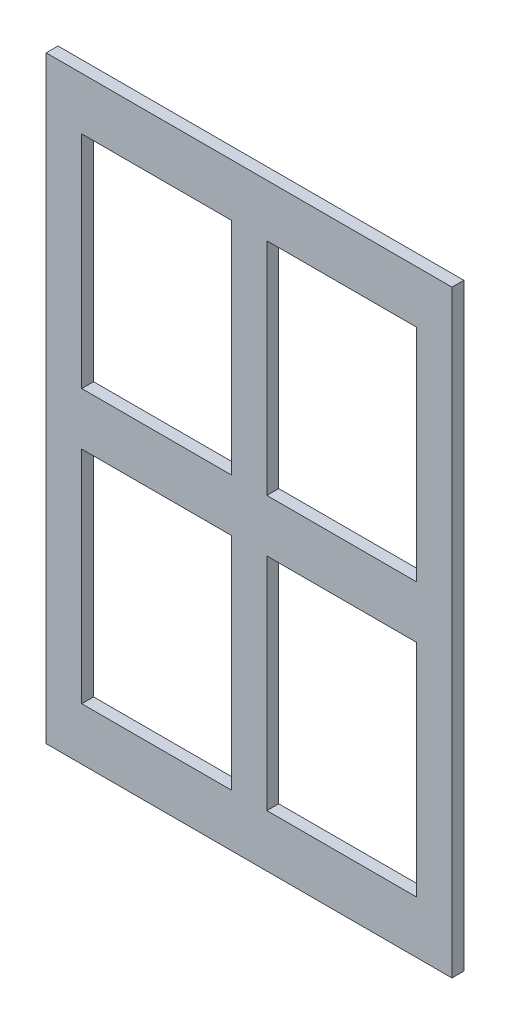
ISO-10303-21;
HEADER;
FILE_DESCRIPTION(('STEP AP214'),'2;1');
FILE_NAME('part.step','',(''),(''),'','','');
FILE_SCHEMA(('AUTOMOTIVE_DESIGN { 1 0 10303 214 1 1 1 1 }'));
ENDSEC;
DATA;
#1=APPLICATION_CONTEXT('core data for automotive mechanical design processes');
#2=APPLICATION_PROTOCOL_DEFINITION('international standard','automotive_design',2000,#1);
#3=PRODUCT_CONTEXT('',#1,'mechanical');
#4=PRODUCT('Part','Part','',(#3));
#5=PRODUCT_RELATED_PRODUCT_CATEGORY('part','',(#4));
#6=PRODUCT_DEFINITION_FORMATION('','',#4);
#7=PRODUCT_DEFINITION_CONTEXT('part definition',#1,'design');
#8=PRODUCT_DEFINITION('design','',#6,#7);
#9=PRODUCT_DEFINITION_SHAPE('','',#8);
#10=(LENGTH_UNIT() NAMED_UNIT(*) SI_UNIT(.MILLI.,.METRE.));
#11=(NAMED_UNIT(*) PLANE_ANGLE_UNIT() SI_UNIT($,.RADIAN.));
#12=(NAMED_UNIT(*) SI_UNIT($,.STERADIAN.) SOLID_ANGLE_UNIT());
#13=UNCERTAINTY_MEASURE_WITH_UNIT(LENGTH_MEASURE(1.E-05),#10,'distance_accuracy_value','');
#14=(GEOMETRIC_REPRESENTATION_CONTEXT(3) GLOBAL_UNCERTAINTY_ASSIGNED_CONTEXT((#13)) GLOBAL_UNIT_ASSIGNED_CONTEXT((#10,
#11,#12)) REPRESENTATION_CONTEXT('',''));
#15=CARTESIAN_POINT('',(0.,0.,0.));
#16=DIRECTION('',(0.,0.,1.));
#17=DIRECTION('',(1.,0.,0.));
#18=AXIS2_PLACEMENT_3D('',#15,#16,#17);
#19=CARTESIAN_POINT('',(0.,0.,4.));
#20=DIRECTION('',(0.,0.,-1.));
#21=DIRECTION('',(-1.,0.,0.));
#22=AXIS2_PLACEMENT_3D('',#19,#20,#21);
#23=PLANE('',#22);
#24=DIRECTION('',(0.,1.,0.));
#25=VECTOR('',#24,1.);
#26=CARTESIAN_POINT('',(-6.00000000000001,-83.3065693430657,4.));
#27=LINE('',#26,#25);
#28=CARTESIAN_POINT('',(-6.00000000000001,-83.3065693430657,4.));
#29=VERTEX_POINT('',#28);
#30=CARTESIAN_POINT('',(-6.00000000000001,-8.84671532846714,4.));
#31=VERTEX_POINT('',#30);
#32=EDGE_CURVE('E206',#29,#31,#27,.T.);
#33=ORIENTED_EDGE('',*,*,#32,.F.);
#34=DIRECTION('',(1.,0.,0.));
#35=VECTOR('',#34,1.);
#36=CARTESIAN_POINT('',(-56.5,-83.3065693430657,4.));
#37=LINE('',#36,#35);
#38=CARTESIAN_POINT('',(-56.5,-83.3065693430657,4.));
#39=VERTEX_POINT('',#38);
#40=EDGE_CURVE('E214',#39,#29,#37,.T.);
#41=ORIENTED_EDGE('',*,*,#40,.F.);
#42=DIRECTION('',(0.,-1.,0.));
#43=VECTOR('',#42,1.);
#44=CARTESIAN_POINT('',(-56.5,-83.3065693430657,4.));
#45=LINE('',#44,#43);
#46=CARTESIAN_POINT('',(-56.5,-8.84671532846714,4.));
#47=VERTEX_POINT('',#46);
#48=EDGE_CURVE('E211',#47,#39,#45,.T.);
#49=ORIENTED_EDGE('',*,*,#48,.F.);
#50=DIRECTION('',(-1.,0.,0.));
#51=VECTOR('',#50,1.);
#52=CARTESIAN_POINT('',(-56.5,-8.84671532846714,4.));
#53=LINE('',#52,#51);
#54=EDGE_CURVE('E208',#31,#47,#53,.T.);
#55=ORIENTED_EDGE('',*,*,#54,.F.);
#56=EDGE_LOOP('',(#33,#41,#49,#55));
#57=FACE_BOUND('',#56,.T.);
#58=DIRECTION('',(0.,1.,0.));
#59=VECTOR('',#58,1.);
#60=CARTESIAN_POINT('',(-6.00000000000001,83.3065693430657,4.));
#61=LINE('',#60,#59);
#62=CARTESIAN_POINT('',(-5.99999999999999,8.84671532846714,4.));
#63=VERTEX_POINT('',#62);
#64=CARTESIAN_POINT('',(-6.00000000000001,83.3065693430657,4.));
#65=VERTEX_POINT('',#64);
#66=EDGE_CURVE('E268',#63,#65,#61,.T.);
#67=ORIENTED_EDGE('',*,*,#66,.F.);
#68=DIRECTION('',(1.,0.,0.));
#69=VECTOR('',#68,1.);
#70=CARTESIAN_POINT('',(-56.5,8.84671532846714,4.));
#71=LINE('',#70,#69);
#72=CARTESIAN_POINT('',(-56.5,8.84671532846714,4.));
#73=VERTEX_POINT('',#72);
#74=EDGE_CURVE('E276',#73,#63,#71,.T.);
#75=ORIENTED_EDGE('',*,*,#74,.F.);
#76=DIRECTION('',(0.,-1.,0.));
#77=VECTOR('',#76,1.);
#78=CARTESIAN_POINT('',(-56.5,83.3065693430657,4.));
#79=LINE('',#78,#77);
#80=CARTESIAN_POINT('',(-56.5,83.3065693430657,4.));
#81=VERTEX_POINT('',#80);
#82=EDGE_CURVE('E273',#81,#73,#79,.T.);
#83=ORIENTED_EDGE('',*,*,#82,.F.);
#84=DIRECTION('',(-1.,0.,0.));
#85=VECTOR('',#84,1.);
#86=CARTESIAN_POINT('',(-56.5,83.3065693430657,4.));
#87=LINE('',#86,#85);
#88=EDGE_CURVE('E270',#65,#81,#87,.T.);
#89=ORIENTED_EDGE('',*,*,#88,.F.);
#90=EDGE_LOOP('',(#67,#75,#83,#89));
#91=FACE_BOUND('',#90,.T.);
#92=DIRECTION('',(0.,1.,0.));
#93=VECTOR('',#92,1.);
#94=CARTESIAN_POINT('',(68.5,-101.,4.));
#95=LINE('',#94,#93);
#96=CARTESIAN_POINT('',(68.5,-101.,4.));
#97=VERTEX_POINT('',#96);
#98=CARTESIAN_POINT('',(68.5,101.,4.));
#99=VERTEX_POINT('',#98);
#100=EDGE_CURVE('E299',#97,#99,#95,.T.);
#101=ORIENTED_EDGE('',*,*,#100,.T.);
#102=DIRECTION('',(-1.,0.,0.));
#103=VECTOR('',#102,1.);
#104=CARTESIAN_POINT('',(-68.5,101.,4.));
#105=LINE('',#104,#103);
#106=CARTESIAN_POINT('',(-68.5,101.,4.));
#107=VERTEX_POINT('',#106);
#108=EDGE_CURVE('E302',#99,#107,#105,.T.);
#109=ORIENTED_EDGE('',*,*,#108,.T.);
#110=DIRECTION('',(0.,-1.,0.));
#111=VECTOR('',#110,1.);
#112=CARTESIAN_POINT('',(-68.5,-101.,4.));
#113=LINE('',#112,#111);
#114=CARTESIAN_POINT('',(-68.5,-101.,4.));
#115=VERTEX_POINT('',#114);
#116=EDGE_CURVE('E305',#107,#115,#113,.T.);
#117=ORIENTED_EDGE('',*,*,#116,.T.);
#118=DIRECTION('',(1.,0.,0.));
#119=VECTOR('',#118,1.);
#120=CARTESIAN_POINT('',(-68.5,-101.,4.));
#121=LINE('',#120,#119);
#122=EDGE_CURVE('E307',#115,#97,#121,.T.);
#123=ORIENTED_EDGE('',*,*,#122,.T.);
#124=EDGE_LOOP('',(#101,#109,#117,#123));
#125=FACE_BOUND('',#124,.T.);
#126=DIRECTION('',(0.,-1.,0.));
#127=VECTOR('',#126,1.);
#128=CARTESIAN_POINT('',(5.99999999999999,83.3065693430657,4.));
#129=LINE('',#128,#127);
#130=CARTESIAN_POINT('',(5.99999999999999,83.3065693430657,4.));
#131=VERTEX_POINT('',#130);
#132=CARTESIAN_POINT('',(6.00000000000001,8.84671532846716,4.));
#133=VERTEX_POINT('',#132);
#134=EDGE_CURVE('E237',#131,#133,#129,.T.);
#135=ORIENTED_EDGE('',*,*,#134,.F.);
#136=DIRECTION('',(-1.,0.,0.));
#137=VECTOR('',#136,1.);
#138=CARTESIAN_POINT('',(56.5,83.3065693430657,4.));
#139=LINE('',#138,#137);
#140=CARTESIAN_POINT('',(56.5,83.3065693430657,4.));
#141=VERTEX_POINT('',#140);
#142=EDGE_CURVE('E245',#141,#131,#139,.T.);
#143=ORIENTED_EDGE('',*,*,#142,.F.);
#144=DIRECTION('',(0.,1.,0.));
#145=VECTOR('',#144,1.);
#146=CARTESIAN_POINT('',(56.5,83.3065693430657,4.));
#147=LINE('',#146,#145);
#148=CARTESIAN_POINT('',(56.5,8.84671532846716,4.));
#149=VERTEX_POINT('',#148);
#150=EDGE_CURVE('E242',#149,#141,#147,.T.);
#151=ORIENTED_EDGE('',*,*,#150,.F.);
#152=DIRECTION('',(1.,0.,0.));
#153=VECTOR('',#152,1.);
#154=CARTESIAN_POINT('',(56.5,8.84671532846716,4.));
#155=LINE('',#154,#153);
#156=EDGE_CURVE('E239',#133,#149,#155,.T.);
#157=ORIENTED_EDGE('',*,*,#156,.F.);
#158=EDGE_LOOP('',(#135,#143,#151,#157));
#159=FACE_BOUND('',#158,.T.);
#160=DIRECTION('',(0.,-1.,0.));
#161=VECTOR('',#160,1.);
#162=CARTESIAN_POINT('',(5.99999999999999,-83.3065693430657,4.));
#163=LINE('',#162,#161);
#164=CARTESIAN_POINT('',(6.,-8.84671532846715,4.));
#165=VERTEX_POINT('',#164);
#166=CARTESIAN_POINT('',(5.99999999999999,-83.3065693430657,4.));
#167=VERTEX_POINT('',#166);
#168=EDGE_CURVE('E170',#165,#167,#163,.T.);
#169=ORIENTED_EDGE('',*,*,#168,.F.);
#170=DIRECTION('',(-1.,0.,0.));
#171=VECTOR('',#170,1.);
#172=CARTESIAN_POINT('',(56.5,-8.84671532846714,4.));
#173=LINE('',#172,#171);
#174=CARTESIAN_POINT('',(56.5,-8.84671532846714,4.));
#175=VERTEX_POINT('',#174);
#176=EDGE_CURVE('E192',#175,#165,#173,.T.);
#177=ORIENTED_EDGE('',*,*,#176,.F.);
#178=DIRECTION('',(0.,1.,0.));
#179=VECTOR('',#178,1.);
#180=CARTESIAN_POINT('',(56.5,-83.3065693430657,4.));
#181=LINE('',#180,#179);
#182=CARTESIAN_POINT('',(56.5,-83.3065693430657,4.));
#183=VERTEX_POINT('',#182);
#184=EDGE_CURVE('E190',#183,#175,#181,.T.);
#185=ORIENTED_EDGE('',*,*,#184,.F.);
#186=DIRECTION('',(1.,0.,0.));
#187=VECTOR('',#186,1.);
#188=CARTESIAN_POINT('',(56.5,-83.3065693430657,4.));
#189=LINE('',#188,#187);
#190=EDGE_CURVE('E178',#167,#183,#189,.T.);
#191=ORIENTED_EDGE('',*,*,#190,.F.);
#192=EDGE_LOOP('',(#169,#177,#185,#191));
#193=FACE_BOUND('',#192,.T.);
#194=ADVANCED_FACE('F33',(#57,#91,#125,#159,#193),#23,.F.);
#195=CARTESIAN_POINT('',(0.,0.,0.));
#196=DIRECTION('',(0.,0.,-1.));
#197=DIRECTION('',(-1.,0.,0.));
#198=AXIS2_PLACEMENT_3D('',#195,#196,#197);
#199=PLANE('',#198);
#200=DIRECTION('',(0.,1.,0.));
#201=VECTOR('',#200,1.);
#202=CARTESIAN_POINT('',(68.5,-101.,0.));
#203=LINE('',#202,#201);
#204=CARTESIAN_POINT('',(68.5,-101.,0.));
#205=VERTEX_POINT('',#204);
#206=CARTESIAN_POINT('',(68.5,101.,0.));
#207=VERTEX_POINT('',#206);
#208=EDGE_CURVE('E298',#205,#207,#203,.T.);
#209=ORIENTED_EDGE('',*,*,#208,.F.);
#210=DIRECTION('',(1.,0.,0.));
#211=VECTOR('',#210,1.);
#212=CARTESIAN_POINT('',(-68.5,-101.,0.));
#213=LINE('',#212,#211);
#214=CARTESIAN_POINT('',(-68.5,-101.,0.));
#215=VERTEX_POINT('',#214);
#216=EDGE_CURVE('E303',#215,#205,#213,.T.);
#217=ORIENTED_EDGE('',*,*,#216,.F.);
#218=DIRECTION('',(0.,-1.,0.));
#219=VECTOR('',#218,1.);
#220=CARTESIAN_POINT('',(-68.5,-101.,0.));
#221=LINE('',#220,#219);
#222=CARTESIAN_POINT('',(-68.5,101.,0.));
#223=VERTEX_POINT('',#222);
#224=EDGE_CURVE('E314',#223,#215,#221,.T.);
#225=ORIENTED_EDGE('',*,*,#224,.F.);
#226=DIRECTION('',(-1.,0.,0.));
#227=VECTOR('',#226,1.);
#228=CARTESIAN_POINT('',(-68.5,101.,0.));
#229=LINE('',#228,#227);
#230=EDGE_CURVE('E312',#207,#223,#229,.T.);
#231=ORIENTED_EDGE('',*,*,#230,.F.);
#232=EDGE_LOOP('',(#209,#217,#225,#231));
#233=FACE_BOUND('',#232,.T.);
#234=DIRECTION('',(1.,0.,0.));
#235=VECTOR('',#234,1.);
#236=CARTESIAN_POINT('',(-56.5,8.84671532846714,0.));
#237=LINE('',#236,#235);
#238=CARTESIAN_POINT('',(-56.5,8.84671532846714,0.));
#239=VERTEX_POINT('',#238);
#240=CARTESIAN_POINT('',(-5.99999999999999,8.84671532846714,0.));
#241=VERTEX_POINT('',#240);
#242=EDGE_CURVE('E271',#239,#241,#237,.T.);
#243=ORIENTED_EDGE('',*,*,#242,.T.);
#244=DIRECTION('',(0.,1.,0.));
#245=VECTOR('',#244,1.);
#246=CARTESIAN_POINT('',(-6.00000000000001,83.3065693430657,0.));
#247=LINE('',#246,#245);
#248=CARTESIAN_POINT('',(-6.00000000000001,83.3065693430657,0.));
#249=VERTEX_POINT('',#248);
#250=EDGE_CURVE('E267',#241,#249,#247,.T.);
#251=ORIENTED_EDGE('',*,*,#250,.T.);
#252=DIRECTION('',(-1.,0.,0.));
#253=VECTOR('',#252,1.);
#254=CARTESIAN_POINT('',(-56.5,83.3065693430657,0.));
#255=LINE('',#254,#253);
#256=CARTESIAN_POINT('',(-56.5,83.3065693430657,0.));
#257=VERTEX_POINT('',#256);
#258=EDGE_CURVE('E281',#249,#257,#255,.T.);
#259=ORIENTED_EDGE('',*,*,#258,.T.);
#260=DIRECTION('',(0.,-1.,0.));
#261=VECTOR('',#260,1.);
#262=CARTESIAN_POINT('',(-56.5,83.3065693430657,0.));
#263=LINE('',#262,#261);
#264=EDGE_CURVE('E284',#257,#239,#263,.T.);
#265=ORIENTED_EDGE('',*,*,#264,.T.);
#266=EDGE_LOOP('',(#243,#251,#259,#265));
#267=FACE_BOUND('',#266,.T.);
#268=DIRECTION('',(-1.,0.,0.));
#269=VECTOR('',#268,1.);
#270=CARTESIAN_POINT('',(56.5,83.3065693430657,0.));
#271=LINE('',#270,#269);
#272=CARTESIAN_POINT('',(56.5,83.3065693430657,0.));
#273=VERTEX_POINT('',#272);
#274=CARTESIAN_POINT('',(5.99999999999999,83.3065693430657,0.));
#275=VERTEX_POINT('',#274);
#276=EDGE_CURVE('E240',#273,#275,#271,.T.);
#277=ORIENTED_EDGE('',*,*,#276,.T.);
#278=DIRECTION('',(0.,-1.,0.));
#279=VECTOR('',#278,1.);
#280=CARTESIAN_POINT('',(5.99999999999999,83.3065693430657,0.));
#281=LINE('',#280,#279);
#282=CARTESIAN_POINT('',(6.00000000000001,8.84671532846716,0.));
#283=VERTEX_POINT('',#282);
#284=EDGE_CURVE('E236',#275,#283,#281,.T.);
#285=ORIENTED_EDGE('',*,*,#284,.T.);
#286=DIRECTION('',(1.,0.,0.));
#287=VECTOR('',#286,1.);
#288=CARTESIAN_POINT('',(56.5,8.84671532846716,0.));
#289=LINE('',#288,#287);
#290=CARTESIAN_POINT('',(56.5,8.84671532846716,0.));
#291=VERTEX_POINT('',#290);
#292=EDGE_CURVE('E250',#283,#291,#289,.T.);
#293=ORIENTED_EDGE('',*,*,#292,.T.);
#294=DIRECTION('',(0.,1.,0.));
#295=VECTOR('',#294,1.);
#296=CARTESIAN_POINT('',(56.5,83.3065693430657,0.));
#297=LINE('',#296,#295);
#298=EDGE_CURVE('E253',#291,#273,#297,.T.);
#299=ORIENTED_EDGE('',*,*,#298,.T.);
#300=EDGE_LOOP('',(#277,#285,#293,#299));
#301=FACE_BOUND('',#300,.T.);
#302=DIRECTION('',(1.,0.,0.));
#303=VECTOR('',#302,1.);
#304=CARTESIAN_POINT('',(-56.5,-83.3065693430657,0.));
#305=LINE('',#304,#303);
#306=CARTESIAN_POINT('',(-56.5,-83.3065693430657,0.));
#307=VERTEX_POINT('',#306);
#308=CARTESIAN_POINT('',(-6.00000000000001,-83.3065693430657,0.));
#309=VERTEX_POINT('',#308);
#310=EDGE_CURVE('E209',#307,#309,#305,.T.);
#311=ORIENTED_EDGE('',*,*,#310,.T.);
#312=DIRECTION('',(0.,1.,0.));
#313=VECTOR('',#312,1.);
#314=CARTESIAN_POINT('',(-6.00000000000001,-83.3065693430657,0.));
#315=LINE('',#314,#313);
#316=CARTESIAN_POINT('',(-6.00000000000001,-8.84671532846714,0.));
#317=VERTEX_POINT('',#316);
#318=EDGE_CURVE('E186',#309,#317,#315,.T.);
#319=ORIENTED_EDGE('',*,*,#318,.T.);
#320=DIRECTION('',(-1.,0.,0.));
#321=VECTOR('',#320,1.);
#322=CARTESIAN_POINT('',(-56.5,-8.84671532846714,0.));
#323=LINE('',#322,#321);
#324=CARTESIAN_POINT('',(-56.5,-8.84671532846714,0.));
#325=VERTEX_POINT('',#324);
#326=EDGE_CURVE('E219',#317,#325,#323,.T.);
#327=ORIENTED_EDGE('',*,*,#326,.T.);
#328=DIRECTION('',(0.,-1.,0.));
#329=VECTOR('',#328,1.);
#330=CARTESIAN_POINT('',(-56.5,-83.3065693430657,0.));
#331=LINE('',#330,#329);
#332=EDGE_CURVE('E222',#325,#307,#331,.T.);
#333=ORIENTED_EDGE('',*,*,#332,.T.);
#334=EDGE_LOOP('',(#311,#319,#327,#333));
#335=FACE_BOUND('',#334,.T.);
#336=DIRECTION('',(-1.,0.,0.));
#337=VECTOR('',#336,1.);
#338=CARTESIAN_POINT('',(56.5,-8.84671532846714,0.));
#339=LINE('',#338,#337);
#340=CARTESIAN_POINT('',(56.5,-8.84671532846714,0.));
#341=VERTEX_POINT('',#340);
#342=CARTESIAN_POINT('',(6.,-8.84671532846715,0.));
#343=VERTEX_POINT('',#342);
#344=EDGE_CURVE('E179',#341,#343,#339,.T.);
#345=ORIENTED_EDGE('',*,*,#344,.T.);
#346=DIRECTION('',(0.,-1.,0.));
#347=VECTOR('',#346,1.);
#348=CARTESIAN_POINT('',(5.99999999999999,-83.3065693430657,0.));
#349=LINE('',#348,#347);
#350=CARTESIAN_POINT('',(5.99999999999999,-83.3065693430657,0.));
#351=VERTEX_POINT('',#350);
#352=EDGE_CURVE('E56',#343,#351,#349,.T.);
#353=ORIENTED_EDGE('',*,*,#352,.T.);
#354=DIRECTION('',(1.,0.,0.));
#355=VECTOR('',#354,1.);
#356=CARTESIAN_POINT('',(56.5,-83.3065693430657,0.));
#357=LINE('',#356,#355);
#358=CARTESIAN_POINT('',(56.5,-83.3065693430657,0.));
#359=VERTEX_POINT('',#358);
#360=EDGE_CURVE('E185',#351,#359,#357,.T.);
#361=ORIENTED_EDGE('',*,*,#360,.T.);
#362=DIRECTION('',(0.,1.,0.));
#363=VECTOR('',#362,1.);
#364=CARTESIAN_POINT('',(56.5,-83.3065693430657,0.));
#365=LINE('',#364,#363);
#366=EDGE_CURVE('E198',#359,#341,#365,.T.);
#367=ORIENTED_EDGE('',*,*,#366,.T.);
#368=EDGE_LOOP('',(#345,#353,#361,#367));
#369=FACE_BOUND('',#368,.T.);
#370=ADVANCED_FACE('F332',(#233,#267,#301,#335,#369),#199,.T.);
#371=CARTESIAN_POINT('',(68.5,-101.,4.));
#372=DIRECTION('',(-1.,0.,0.));
#373=DIRECTION('',(0.,0.,1.));
#374=AXIS2_PLACEMENT_3D('',#371,#372,#373);
#375=PLANE('',#374);
#376=ORIENTED_EDGE('',*,*,#208,.T.);
#377=DIRECTION('',(0.,0.,-1.));
#378=VECTOR('',#377,1.);
#379=CARTESIAN_POINT('',(68.5,101.,4.));
#380=LINE('',#379,#378);
#381=EDGE_CURVE('E11',#99,#207,#380,.T.);
#382=ORIENTED_EDGE('',*,*,#381,.F.);
#383=ORIENTED_EDGE('',*,*,#100,.F.);
#384=DIRECTION('',(0.,0.,-1.));
#385=VECTOR('',#384,1.);
#386=CARTESIAN_POINT('',(68.5,-101.,4.));
#387=LINE('',#386,#385);
#388=EDGE_CURVE('E309',#97,#205,#387,.T.);
#389=ORIENTED_EDGE('',*,*,#388,.T.);
#390=EDGE_LOOP('',(#376,#382,#383,#389));
#391=FACE_BOUND('',#390,.T.);
#392=ADVANCED_FACE('F35',(#391),#375,.F.);
#393=CARTESIAN_POINT('',(-68.5,101.,4.));
#394=DIRECTION('',(0.,-1.,0.));
#395=DIRECTION('',(0.,0.,-1.));
#396=AXIS2_PLACEMENT_3D('',#393,#394,#395);
#397=PLANE('',#396);
#398=ORIENTED_EDGE('',*,*,#230,.T.);
#399=DIRECTION('',(0.,0.,-1.));
#400=VECTOR('',#399,1.);
#401=CARTESIAN_POINT('',(-68.5,101.,4.));
#402=LINE('',#401,#400);
#403=EDGE_CURVE('E41',#107,#223,#402,.T.);
#404=ORIENTED_EDGE('',*,*,#403,.F.);
#405=ORIENTED_EDGE('',*,*,#108,.F.);
#406=ORIENTED_EDGE('',*,*,#381,.T.);
#407=EDGE_LOOP('',(#398,#404,#405,#406));
#408=FACE_BOUND('',#407,.T.);
#409=ADVANCED_FACE('F343',(#408),#397,.F.);
#410=CARTESIAN_POINT('',(-68.5,-101.,4.));
#411=DIRECTION('',(1.,0.,0.));
#412=DIRECTION('',(0.,0.,-1.));
#413=AXIS2_PLACEMENT_3D('',#410,#411,#412);
#414=PLANE('',#413);
#415=ORIENTED_EDGE('',*,*,#224,.T.);
#416=DIRECTION('',(0.,0.,-1.));
#417=VECTOR('',#416,1.);
#418=CARTESIAN_POINT('',(-68.5,-101.,4.));
#419=LINE('',#418,#417);
#420=EDGE_CURVE('E319',#115,#215,#419,.T.);
#421=ORIENTED_EDGE('',*,*,#420,.F.);
#422=ORIENTED_EDGE('',*,*,#116,.F.);
#423=ORIENTED_EDGE('',*,*,#403,.T.);
#424=EDGE_LOOP('',(#415,#421,#422,#423));
#425=FACE_BOUND('',#424,.T.);
#426=ADVANCED_FACE('F326',(#425),#414,.F.);
#427=CARTESIAN_POINT('',(-68.5,-101.,4.));
#428=DIRECTION('',(0.,1.,0.));
#429=DIRECTION('',(0.,0.,1.));
#430=AXIS2_PLACEMENT_3D('',#427,#428,#429);
#431=PLANE('',#430);
#432=ORIENTED_EDGE('',*,*,#216,.T.);
#433=ORIENTED_EDGE('',*,*,#388,.F.);
#434=ORIENTED_EDGE('',*,*,#122,.F.);
#435=ORIENTED_EDGE('',*,*,#420,.T.);
#436=EDGE_LOOP('',(#432,#433,#434,#435));
#437=FACE_BOUND('',#436,.T.);
#438=ADVANCED_FACE('F336',(#437),#431,.F.);
#439=CARTESIAN_POINT('',(-6.00000000000001,83.3065693430657,4.));
#440=DIRECTION('',(-1.,0.,0.));
#441=DIRECTION('',(0.,-1.,0.));
#442=AXIS2_PLACEMENT_3D('',#439,#440,#441);
#443=PLANE('',#442);
#444=ORIENTED_EDGE('',*,*,#250,.F.);
#445=DIRECTION('',(0.,0.,-1.));
#446=VECTOR('',#445,1.);
#447=CARTESIAN_POINT('',(-5.99999999999999,8.84671532846714,4.));
#448=LINE('',#447,#446);
#449=EDGE_CURVE('E278',#63,#241,#448,.T.);
#450=ORIENTED_EDGE('',*,*,#449,.F.);
#451=ORIENTED_EDGE('',*,*,#66,.T.);
#452=DIRECTION('',(0.,0.,-1.));
#453=VECTOR('',#452,1.);
#454=CARTESIAN_POINT('',(-6.00000000000001,83.3065693430657,4.));
#455=LINE('',#454,#453);
#456=EDGE_CURVE('E295',#65,#249,#455,.T.);
#457=ORIENTED_EDGE('',*,*,#456,.T.);
#458=EDGE_LOOP('',(#444,#450,#451,#457));
#459=FACE_BOUND('',#458,.T.);
#460=ADVANCED_FACE('F360',(#459),#443,.T.);
#461=CARTESIAN_POINT('',(-56.5,83.3065693430657,4.));
#462=DIRECTION('',(0.,-1.,0.));
#463=DIRECTION('',(1.,0.,0.));
#464=AXIS2_PLACEMENT_3D('',#461,#462,#463);
#465=PLANE('',#464);
#466=ORIENTED_EDGE('',*,*,#258,.F.);
#467=ORIENTED_EDGE('',*,*,#456,.F.);
#468=ORIENTED_EDGE('',*,*,#88,.T.);
#469=DIRECTION('',(0.,0.,-1.));
#470=VECTOR('',#469,1.);
#471=CARTESIAN_POINT('',(-56.5,83.3065693430657,4.));
#472=LINE('',#471,#470);
#473=EDGE_CURVE('E293',#81,#257,#472,.T.);
#474=ORIENTED_EDGE('',*,*,#473,.T.);
#475=EDGE_LOOP('',(#466,#467,#468,#474));
#476=FACE_BOUND('',#475,.T.);
#477=ADVANCED_FACE('F367',(#476),#465,.T.);
#478=CARTESIAN_POINT('',(-56.5,83.3065693430657,4.));
#479=DIRECTION('',(1.,0.,0.));
#480=DIRECTION('',(0.,0.,-1.));
#481=AXIS2_PLACEMENT_3D('',#478,#479,#480);
#482=PLANE('',#481);
#483=ORIENTED_EDGE('',*,*,#264,.F.);
#484=ORIENTED_EDGE('',*,*,#473,.F.);
#485=ORIENTED_EDGE('',*,*,#82,.T.);
#486=DIRECTION('',(0.,0.,-1.));
#487=VECTOR('',#486,1.);
#488=CARTESIAN_POINT('',(-56.5,8.84671532846714,4.));
#489=LINE('',#488,#487);
#490=EDGE_CURVE('E291',#73,#239,#489,.T.);
#491=ORIENTED_EDGE('',*,*,#490,.T.);
#492=EDGE_LOOP('',(#483,#484,#485,#491));
#493=FACE_BOUND('',#492,.T.);
#494=ADVANCED_FACE('F372',(#493),#482,.T.);
#495=CARTESIAN_POINT('',(-56.5,8.84671532846714,4.));
#496=DIRECTION('',(0.,1.,0.));
#497=DIRECTION('',(-1.,0.,0.));
#498=AXIS2_PLACEMENT_3D('',#495,#496,#497);
#499=PLANE('',#498);
#500=ORIENTED_EDGE('',*,*,#242,.F.);
#501=ORIENTED_EDGE('',*,*,#490,.F.);
#502=ORIENTED_EDGE('',*,*,#74,.T.);
#503=ORIENTED_EDGE('',*,*,#449,.T.);
#504=EDGE_LOOP('',(#500,#501,#502,#503));
#505=FACE_BOUND('',#504,.T.);
#506=ADVANCED_FACE('F379',(#505),#499,.T.);
#507=CARTESIAN_POINT('',(5.99999999999999,83.3065693430657,4.));
#508=DIRECTION('',(1.,0.,0.));
#509=DIRECTION('',(0.,1.,0.));
#510=AXIS2_PLACEMENT_3D('',#507,#508,#509);
#511=PLANE('',#510);
#512=ORIENTED_EDGE('',*,*,#284,.F.);
#513=DIRECTION('',(0.,0.,-1.));
#514=VECTOR('',#513,1.);
#515=CARTESIAN_POINT('',(5.99999999999999,83.3065693430657,4.));
#516=LINE('',#515,#514);
#517=EDGE_CURVE('E247',#131,#275,#516,.T.);
#518=ORIENTED_EDGE('',*,*,#517,.F.);
#519=ORIENTED_EDGE('',*,*,#134,.T.);
#520=DIRECTION('',(0.,0.,-1.));
#521=VECTOR('',#520,1.);
#522=CARTESIAN_POINT('',(6.00000000000001,8.84671532846716,4.));
#523=LINE('',#522,#521);
#524=EDGE_CURVE('E264',#133,#283,#523,.T.);
#525=ORIENTED_EDGE('',*,*,#524,.T.);
#526=EDGE_LOOP('',(#512,#518,#519,#525));
#527=FACE_BOUND('',#526,.T.);
#528=ADVANCED_FACE('F392',(#527),#511,.T.);
#529=CARTESIAN_POINT('',(56.5,8.84671532846716,4.));
#530=DIRECTION('',(0.,1.,0.));
#531=DIRECTION('',(-1.,0.,0.));
#532=AXIS2_PLACEMENT_3D('',#529,#530,#531);
#533=PLANE('',#532);
#534=ORIENTED_EDGE('',*,*,#292,.F.);
#535=ORIENTED_EDGE('',*,*,#524,.F.);
#536=ORIENTED_EDGE('',*,*,#156,.T.);
#537=DIRECTION('',(0.,0.,-1.));
#538=VECTOR('',#537,1.);
#539=CARTESIAN_POINT('',(56.5,8.84671532846716,4.));
#540=LINE('',#539,#538);
#541=EDGE_CURVE('E262',#149,#291,#540,.T.);
#542=ORIENTED_EDGE('',*,*,#541,.T.);
#543=EDGE_LOOP('',(#534,#535,#536,#542));
#544=FACE_BOUND('',#543,.T.);
#545=ADVANCED_FACE('F397',(#544),#533,.T.);
#546=CARTESIAN_POINT('',(56.5,83.3065693430657,4.));
#547=DIRECTION('',(-1.,0.,0.));
#548=DIRECTION('',(0.,-1.,0.));
#549=AXIS2_PLACEMENT_3D('',#546,#547,#548);
#550=PLANE('',#549);
#551=ORIENTED_EDGE('',*,*,#298,.F.);
#552=ORIENTED_EDGE('',*,*,#541,.F.);
#553=ORIENTED_EDGE('',*,*,#150,.T.);
#554=DIRECTION('',(0.,0.,-1.));
#555=VECTOR('',#554,1.);
#556=CARTESIAN_POINT('',(56.5,83.3065693430657,4.));
#557=LINE('',#556,#555);
#558=EDGE_CURVE('E260',#141,#273,#557,.T.);
#559=ORIENTED_EDGE('',*,*,#558,.T.);
#560=EDGE_LOOP('',(#551,#552,#553,#559));
#561=FACE_BOUND('',#560,.T.);
#562=ADVANCED_FACE('F401',(#561),#550,.T.);
#563=CARTESIAN_POINT('',(56.5,83.3065693430657,4.));
#564=DIRECTION('',(0.,-1.,0.));
#565=DIRECTION('',(1.,0.,0.));
#566=AXIS2_PLACEMENT_3D('',#563,#564,#565);
#567=PLANE('',#566);
#568=ORIENTED_EDGE('',*,*,#276,.F.);
#569=ORIENTED_EDGE('',*,*,#558,.F.);
#570=ORIENTED_EDGE('',*,*,#142,.T.);
#571=ORIENTED_EDGE('',*,*,#517,.T.);
#572=EDGE_LOOP('',(#568,#569,#570,#571));
#573=FACE_BOUND('',#572,.T.);
#574=ADVANCED_FACE('F405',(#573),#567,.T.);
#575=CARTESIAN_POINT('',(-6.00000000000001,-83.3065693430657,4.));
#576=DIRECTION('',(-1.,0.,0.));
#577=DIRECTION('',(0.,0.,1.));
#578=AXIS2_PLACEMENT_3D('',#575,#576,#577);
#579=PLANE('',#578);
#580=ORIENTED_EDGE('',*,*,#318,.F.);
#581=DIRECTION('',(0.,0.,-1.));
#582=VECTOR('',#581,1.);
#583=CARTESIAN_POINT('',(-6.00000000000001,-83.3065693430657,4.));
#584=LINE('',#583,#582);
#585=EDGE_CURVE('E216',#29,#309,#584,.T.);
#586=ORIENTED_EDGE('',*,*,#585,.F.);
#587=ORIENTED_EDGE('',*,*,#32,.T.);
#588=DIRECTION('',(0.,0.,-1.));
#589=VECTOR('',#588,1.);
#590=CARTESIAN_POINT('',(-6.00000000000001,-8.84671532846714,4.));
#591=LINE('',#590,#589);
#592=EDGE_CURVE('E233',#31,#317,#591,.T.);
#593=ORIENTED_EDGE('',*,*,#592,.T.);
#594=EDGE_LOOP('',(#580,#586,#587,#593));
#595=FACE_BOUND('',#594,.T.);
#596=ADVANCED_FACE('F409',(#595),#579,.T.);
#597=CARTESIAN_POINT('',(-56.5,-8.84671532846714,4.));
#598=DIRECTION('',(0.,-1.,0.));
#599=DIRECTION('',(0.,0.,-1.));
#600=AXIS2_PLACEMENT_3D('',#597,#598,#599);
#601=PLANE('',#600);
#602=ORIENTED_EDGE('',*,*,#326,.F.);
#603=ORIENTED_EDGE('',*,*,#592,.F.);
#604=ORIENTED_EDGE('',*,*,#54,.T.);
#605=DIRECTION('',(0.,0.,-1.));
#606=VECTOR('',#605,1.);
#607=CARTESIAN_POINT('',(-56.5,-8.84671532846714,4.));
#608=LINE('',#607,#606);
#609=EDGE_CURVE('E231',#47,#325,#608,.T.);
#610=ORIENTED_EDGE('',*,*,#609,.T.);
#611=EDGE_LOOP('',(#602,#603,#604,#610));
#612=FACE_BOUND('',#611,.T.);
#613=ADVANCED_FACE('F413',(#612),#601,.T.);
#614=CARTESIAN_POINT('',(-56.5,-83.3065693430657,4.));
#615=DIRECTION('',(1.,0.,0.));
#616=DIRECTION('',(0.,0.,-1.));
#617=AXIS2_PLACEMENT_3D('',#614,#615,#616);
#618=PLANE('',#617);
#619=ORIENTED_EDGE('',*,*,#332,.F.);
#620=ORIENTED_EDGE('',*,*,#609,.F.);
#621=ORIENTED_EDGE('',*,*,#48,.T.);
#622=DIRECTION('',(0.,0.,-1.));
#623=VECTOR('',#622,1.);
#624=CARTESIAN_POINT('',(-56.5,-83.3065693430657,4.));
#625=LINE('',#624,#623);
#626=EDGE_CURVE('E229',#39,#307,#625,.T.);
#627=ORIENTED_EDGE('',*,*,#626,.T.);
#628=EDGE_LOOP('',(#619,#620,#621,#627));
#629=FACE_BOUND('',#628,.T.);
#630=ADVANCED_FACE('F417',(#629),#618,.T.);
#631=CARTESIAN_POINT('',(-56.5,-83.3065693430657,4.));
#632=DIRECTION('',(0.,1.,0.));
#633=DIRECTION('',(0.,0.,1.));
#634=AXIS2_PLACEMENT_3D('',#631,#632,#633);
#635=PLANE('',#634);
#636=ORIENTED_EDGE('',*,*,#310,.F.);
#637=ORIENTED_EDGE('',*,*,#626,.F.);
#638=ORIENTED_EDGE('',*,*,#40,.T.);
#639=ORIENTED_EDGE('',*,*,#585,.T.);
#640=EDGE_LOOP('',(#636,#637,#638,#639));
#641=FACE_BOUND('',#640,.T.);
#642=ADVANCED_FACE('F421',(#641),#635,.T.);
#643=CARTESIAN_POINT('',(5.99999999999999,-83.3065693430657,4.));
#644=DIRECTION('',(1.,0.,0.));
#645=DIRECTION('',(0.,1.,0.));
#646=AXIS2_PLACEMENT_3D('',#643,#644,#645);
#647=PLANE('',#646);
#648=ORIENTED_EDGE('',*,*,#352,.F.);
#649=DIRECTION('',(0.,0.,-1.));
#650=VECTOR('',#649,1.);
#651=CARTESIAN_POINT('',(6.,-8.84671532846715,4.));
#652=LINE('',#651,#650);
#653=EDGE_CURVE('E174',#165,#343,#652,.T.);
#654=ORIENTED_EDGE('',*,*,#653,.F.);
#655=ORIENTED_EDGE('',*,*,#168,.T.);
#656=DIRECTION('',(0.,0.,-1.));
#657=VECTOR('',#656,1.);
#658=CARTESIAN_POINT('',(5.99999999999999,-83.3065693430657,4.));
#659=LINE('',#658,#657);
#660=EDGE_CURVE('E173',#167,#351,#659,.T.);
#661=ORIENTED_EDGE('',*,*,#660,.T.);
#662=EDGE_LOOP('',(#648,#654,#655,#661));
#663=FACE_BOUND('',#662,.T.);
#664=ADVANCED_FACE('F172',(#663),#647,.T.);
#665=CARTESIAN_POINT('',(56.5,-83.3065693430657,4.));
#666=DIRECTION('',(0.,1.,0.));
#667=DIRECTION('',(-1.,0.,0.));
#668=AXIS2_PLACEMENT_3D('',#665,#666,#667);
#669=PLANE('',#668);
#670=ORIENTED_EDGE('',*,*,#360,.F.);
#671=ORIENTED_EDGE('',*,*,#660,.F.);
#672=ORIENTED_EDGE('',*,*,#190,.T.);
#673=DIRECTION('',(0.,0.,-1.));
#674=VECTOR('',#673,1.);
#675=CARTESIAN_POINT('',(56.5,-83.3065693430657,4.));
#676=LINE('',#675,#674);
#677=EDGE_CURVE('E187',#183,#359,#676,.T.);
#678=ORIENTED_EDGE('',*,*,#677,.T.);
#679=EDGE_LOOP('',(#670,#671,#672,#678));
#680=FACE_BOUND('',#679,.T.);
#681=ADVANCED_FACE('F182',(#680),#669,.T.);
#682=CARTESIAN_POINT('',(56.5,-83.3065693430657,4.));
#683=DIRECTION('',(-1.,0.,0.));
#684=DIRECTION('',(0.,-1.,0.));
#685=AXIS2_PLACEMENT_3D('',#682,#683,#684);
#686=PLANE('',#685);
#687=ORIENTED_EDGE('',*,*,#366,.F.);
#688=ORIENTED_EDGE('',*,*,#677,.F.);
#689=ORIENTED_EDGE('',*,*,#184,.T.);
#690=DIRECTION('',(0.,0.,-1.));
#691=VECTOR('',#690,1.);
#692=CARTESIAN_POINT('',(56.5,-8.84671532846714,4.));
#693=LINE('',#692,#691);
#694=EDGE_CURVE('E48',#175,#341,#693,.T.);
#695=ORIENTED_EDGE('',*,*,#694,.T.);
#696=EDGE_LOOP('',(#687,#688,#689,#695));
#697=FACE_BOUND('',#696,.T.);
#698=ADVANCED_FACE('F430',(#697),#686,.T.);
#699=CARTESIAN_POINT('',(56.5,-8.84671532846714,4.));
#700=DIRECTION('',(0.,-1.,0.));
#701=DIRECTION('',(1.,0.,0.));
#702=AXIS2_PLACEMENT_3D('',#699,#700,#701);
#703=PLANE('',#702);
#704=ORIENTED_EDGE('',*,*,#344,.F.);
#705=ORIENTED_EDGE('',*,*,#694,.F.);
#706=ORIENTED_EDGE('',*,*,#176,.T.);
#707=ORIENTED_EDGE('',*,*,#653,.T.);
#708=EDGE_LOOP('',(#704,#705,#706,#707));
#709=FACE_BOUND('',#708,.T.);
#710=ADVANCED_FACE('F433',(#709),#703,.T.);
#711=CLOSED_SHELL('',(#194,#370,#392,#409,#426,#438,#460,#477,#494,#506,#528,#545,#562,#574,
#596,#613,#630,#642,#664,#681,#698,#710));
#712=MANIFOLD_SOLID_BREP('B2',#711);
#713=ADVANCED_BREP_SHAPE_REPRESENTATION('',(#18,#712),#14);
#714=SHAPE_DEFINITION_REPRESENTATION(#9,#713);
ENDSEC;
END-ISO-10303-21;
